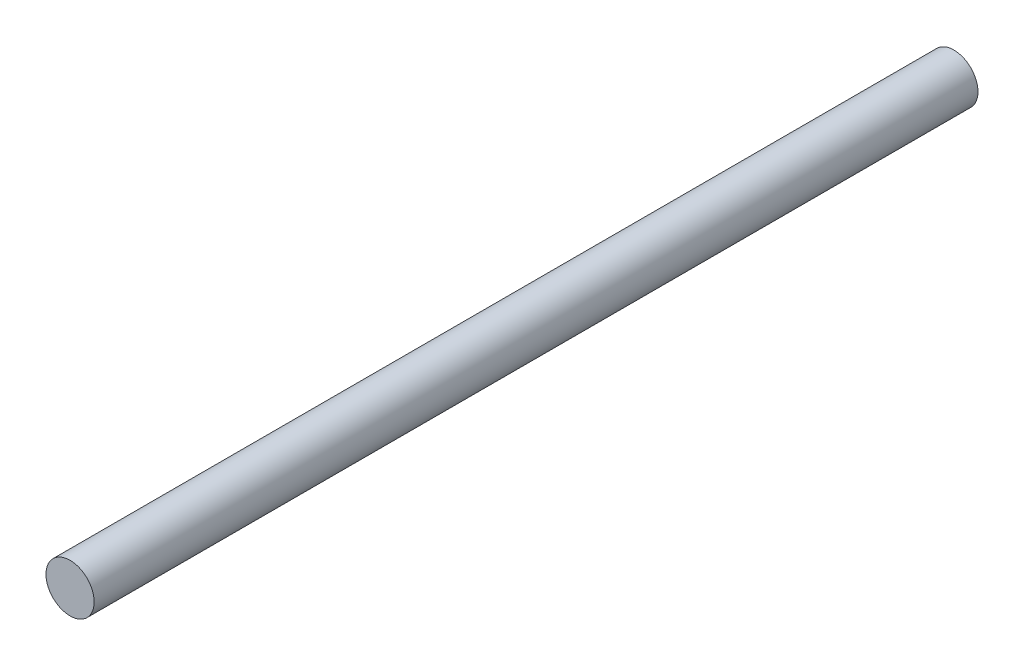
ISO-10303-21;
HEADER;
FILE_DESCRIPTION(('STEP AP214'),'2;1');
FILE_NAME('part.step','',(''),(''),'','','');
FILE_SCHEMA(('AUTOMOTIVE_DESIGN { 1 0 10303 214 1 1 1 1 }'));
ENDSEC;
DATA;
#1=APPLICATION_CONTEXT('core data for automotive mechanical design processes');
#2=APPLICATION_PROTOCOL_DEFINITION('international standard','automotive_design',2000,#1);
#3=PRODUCT_CONTEXT('',#1,'mechanical');
#4=PRODUCT('Part','Part','',(#3));
#5=PRODUCT_RELATED_PRODUCT_CATEGORY('part','',(#4));
#6=PRODUCT_DEFINITION_FORMATION('','',#4);
#7=PRODUCT_DEFINITION_CONTEXT('part definition',#1,'design');
#8=PRODUCT_DEFINITION('design','',#6,#7);
#9=PRODUCT_DEFINITION_SHAPE('','',#8);
#10=(LENGTH_UNIT() NAMED_UNIT(*) SI_UNIT(.MILLI.,.METRE.));
#11=(NAMED_UNIT(*) PLANE_ANGLE_UNIT() SI_UNIT($,.RADIAN.));
#12=(NAMED_UNIT(*) SI_UNIT($,.STERADIAN.) SOLID_ANGLE_UNIT());
#13=UNCERTAINTY_MEASURE_WITH_UNIT(LENGTH_MEASURE(1.E-05),#10,'distance_accuracy_value','');
#14=(GEOMETRIC_REPRESENTATION_CONTEXT(3) GLOBAL_UNCERTAINTY_ASSIGNED_CONTEXT((#13)) GLOBAL_UNIT_ASSIGNED_CONTEXT((#10,
#11,#12)) REPRESENTATION_CONTEXT('',''));
#15=CARTESIAN_POINT('',(0.,0.,0.));
#16=DIRECTION('',(0.,0.,1.));
#17=DIRECTION('',(1.,0.,0.));
#18=AXIS2_PLACEMENT_3D('',#15,#16,#17);
#19=CARTESIAN_POINT('',(0.,0.,110.));
#20=DIRECTION('',(0.,0.,-1.));
#21=DIRECTION('',(-1.,0.,0.));
#22=AXIS2_PLACEMENT_3D('',#19,#20,#21);
#23=CYLINDRICAL_SURFACE('',#22,3.);
#24=CARTESIAN_POINT('',(0.,0.,110.));
#25=DIRECTION('',(0.,0.,1.));
#26=DIRECTION('',(1.,0.,0.));
#27=AXIS2_PLACEMENT_3D('',#24,#25,#26);
#28=CIRCLE('',#27,3.);
#29=CARTESIAN_POINT('',(3.,0.,110.));
#30=VERTEX_POINT('',#29);
#31=EDGE_CURVE('E10',#30,#30,#28,.T.);
#32=ORIENTED_EDGE('',*,*,#31,.F.);
#33=EDGE_LOOP('',(#32));
#34=FACE_BOUND('',#33,.T.);
#35=CARTESIAN_POINT('',(0.,0.,0.));
#36=DIRECTION('',(0.,0.,1.));
#37=DIRECTION('',(1.,0.,0.));
#38=AXIS2_PLACEMENT_3D('',#35,#36,#37);
#39=CIRCLE('',#38,3.);
#40=CARTESIAN_POINT('',(3.,0.,0.));
#41=VERTEX_POINT('',#40);
#42=EDGE_CURVE('E38',#41,#41,#39,.T.);
#43=ORIENTED_EDGE('',*,*,#42,.T.);
#44=EDGE_LOOP('',(#43));
#45=FACE_BOUND('',#44,.T.);
#46=ADVANCED_FACE('F35',(#34,#45),#23,.T.);
#47=CARTESIAN_POINT('',(0.,0.,110.));
#48=DIRECTION('',(0.,0.,1.));
#49=DIRECTION('',(1.,0.,0.));
#50=AXIS2_PLACEMENT_3D('',#47,#48,#49);
#51=PLANE('',#50);
#52=ORIENTED_EDGE('',*,*,#31,.T.);
#53=EDGE_LOOP('',(#52));
#54=FACE_BOUND('',#53,.T.);
#55=ADVANCED_FACE('F50',(#54),#51,.T.);
#56=CARTESIAN_POINT('',(0.,0.,0.));
#57=DIRECTION('',(0.,0.,1.));
#58=DIRECTION('',(1.,0.,0.));
#59=AXIS2_PLACEMENT_3D('',#56,#57,#58);
#60=PLANE('',#59);
#61=ORIENTED_EDGE('',*,*,#42,.F.);
#62=EDGE_LOOP('',(#61));
#63=FACE_BOUND('',#62,.T.);
#64=ADVANCED_FACE('F48',(#63),#60,.F.);
#65=CLOSED_SHELL('',(#46,#55,#64));
#66=MANIFOLD_SOLID_BREP('B2',#65);
#67=ADVANCED_BREP_SHAPE_REPRESENTATION('',(#18,#66),#14);
#68=SHAPE_DEFINITION_REPRESENTATION(#9,#67);
ENDSEC;
END-ISO-10303-21;
